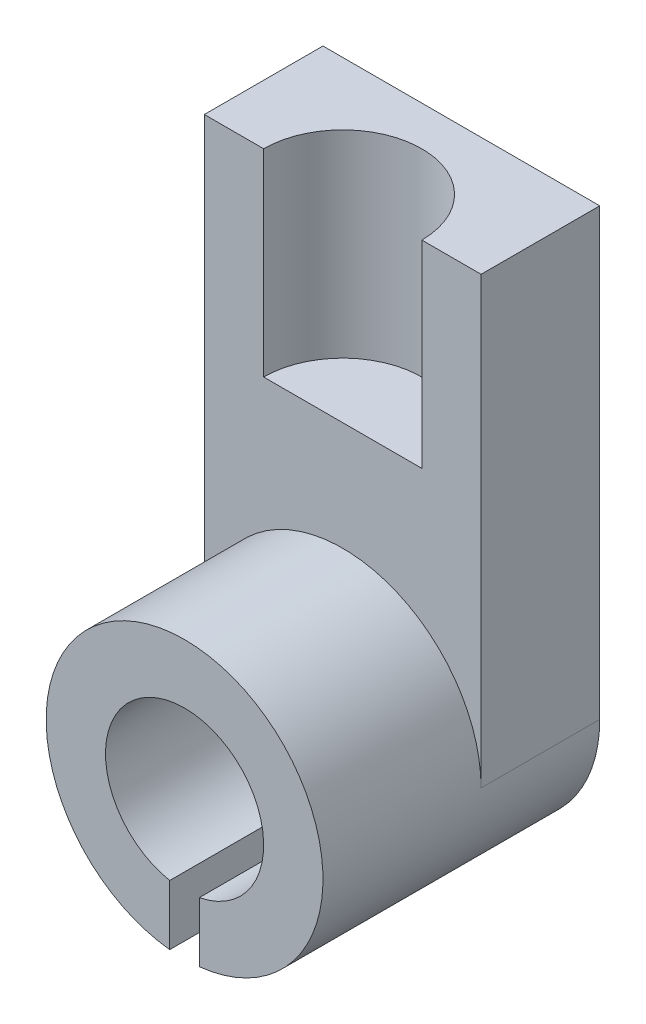
ISO-10303-21;
HEADER;
FILE_DESCRIPTION(('STEP AP214'),'2;1');
FILE_NAME('part.step','',(''),(''),'','','');
FILE_SCHEMA(('AUTOMOTIVE_DESIGN { 1 0 10303 214 1 1 1 1 }'));
ENDSEC;
DATA;
#1=APPLICATION_CONTEXT('core data for automotive mechanical design processes');
#2=APPLICATION_PROTOCOL_DEFINITION('international standard','automotive_design',2000,#1);
#3=PRODUCT_CONTEXT('',#1,'mechanical');
#4=PRODUCT('Part','Part','',(#3));
#5=PRODUCT_RELATED_PRODUCT_CATEGORY('part','',(#4));
#6=PRODUCT_DEFINITION_FORMATION('','',#4);
#7=PRODUCT_DEFINITION_CONTEXT('part definition',#1,'design');
#8=PRODUCT_DEFINITION('design','',#6,#7);
#9=PRODUCT_DEFINITION_SHAPE('','',#8);
#10=(LENGTH_UNIT() NAMED_UNIT(*) SI_UNIT(.MILLI.,.METRE.));
#11=(NAMED_UNIT(*) PLANE_ANGLE_UNIT() SI_UNIT($,.RADIAN.));
#12=(NAMED_UNIT(*) SI_UNIT($,.STERADIAN.) SOLID_ANGLE_UNIT());
#13=UNCERTAINTY_MEASURE_WITH_UNIT(LENGTH_MEASURE(1.E-05),#10,'distance_accuracy_value','');
#14=(GEOMETRIC_REPRESENTATION_CONTEXT(3) GLOBAL_UNCERTAINTY_ASSIGNED_CONTEXT((#13)) GLOBAL_UNIT_ASSIGNED_CONTEXT((#10,
#11,#12)) REPRESENTATION_CONTEXT('',''));
#15=CARTESIAN_POINT('',(0.,0.,0.));
#16=DIRECTION('',(0.,0.,1.));
#17=DIRECTION('',(1.,0.,0.));
#18=AXIS2_PLACEMENT_3D('',#15,#16,#17);
#19=CARTESIAN_POINT('',(0.,0.,56.));
#20=DIRECTION('',(0.,0.,-1.));
#21=DIRECTION('',(-1.,0.,0.));
#22=AXIS2_PLACEMENT_3D('',#19,#20,#21);
#23=CYLINDRICAL_SURFACE('',#22,16.);
#24=CARTESIAN_POINT('',(0.,0.,0.));
#25=DIRECTION('',(0.,0.,-1.));
#26=DIRECTION('',(1.,0.,0.));
#27=AXIS2_PLACEMENT_3D('',#24,#25,#26);
#28=CIRCLE('',#27,16.);
#29=CARTESIAN_POINT('',(-3.,-15.7162336455017,0.));
#30=VERTEX_POINT('',#29);
#31=CARTESIAN_POINT('',(3.,-15.7162336455017,0.));
#32=VERTEX_POINT('',#31);
#33=EDGE_CURVE('E151',#30,#32,#28,.T.);
#34=ORIENTED_EDGE('',*,*,#33,.T.);
#35=DIRECTION('',(0.,0.,-1.));
#36=VECTOR('',#35,1.);
#37=CARTESIAN_POINT('',(3.,-15.7162336455017,56.));
#38=LINE('',#37,#36);
#39=CARTESIAN_POINT('',(3.,-15.7162336455017,56.));
#40=VERTEX_POINT('',#39);
#41=EDGE_CURVE('E11',#40,#32,#38,.T.);
#42=ORIENTED_EDGE('',*,*,#41,.F.);
#43=CARTESIAN_POINT('',(0.,0.,56.));
#44=DIRECTION('',(0.,0.,-1.));
#45=DIRECTION('',(1.,0.,0.));
#46=AXIS2_PLACEMENT_3D('',#43,#44,#45);
#47=CIRCLE('',#46,16.);
#48=CARTESIAN_POINT('',(-3.,-15.7162336455017,56.));
#49=VERTEX_POINT('',#48);
#50=EDGE_CURVE('E155',#49,#40,#47,.T.);
#51=ORIENTED_EDGE('',*,*,#50,.F.);
#52=DIRECTION('',(0.,0.,-1.));
#53=VECTOR('',#52,1.);
#54=CARTESIAN_POINT('',(-3.,-15.7162336455017,56.));
#55=LINE('',#54,#53);
#56=EDGE_CURVE('E165',#49,#30,#55,.T.);
#57=ORIENTED_EDGE('',*,*,#56,.T.);
#58=EDGE_LOOP('',(#34,#42,#51,#57));
#59=FACE_BOUND('',#58,.T.);
#60=ADVANCED_FACE('F33',(#59),#23,.F.);
#61=CARTESIAN_POINT('',(3.,-15.7162336455017,56.));
#62=DIRECTION('',(1.,0.,0.));
#63=DIRECTION('',(0.,1.,0.));
#64=AXIS2_PLACEMENT_3D('',#61,#62,#63);
#65=PLANE('',#64);
#66=DIRECTION('',(0.,-1.,0.));
#67=VECTOR('',#66,1.);
#68=CARTESIAN_POINT('',(3.,-15.7162336455017,0.));
#69=LINE('',#68,#67);
#70=CARTESIAN_POINT('',(2.99999999999998,-27.8388218141501,0.));
#71=VERTEX_POINT('',#70);
#72=EDGE_CURVE('E168',#32,#71,#69,.T.);
#73=ORIENTED_EDGE('',*,*,#72,.T.);
#74=DIRECTION('',(0.,0.,-1.));
#75=VECTOR('',#74,1.);
#76=CARTESIAN_POINT('',(2.99999999999998,-27.8388218141501,56.));
#77=LINE('',#76,#75);
#78=CARTESIAN_POINT('',(2.99999999999998,-27.8388218141501,56.));
#79=VERTEX_POINT('',#78);
#80=EDGE_CURVE('E40',#79,#71,#77,.T.);
#81=ORIENTED_EDGE('',*,*,#80,.F.);
#82=DIRECTION('',(0.,-1.,0.));
#83=VECTOR('',#82,1.);
#84=CARTESIAN_POINT('',(3.,-15.7162336455017,56.));
#85=LINE('',#84,#83);
#86=EDGE_CURVE('E158',#40,#79,#85,.T.);
#87=ORIENTED_EDGE('',*,*,#86,.F.);
#88=ORIENTED_EDGE('',*,*,#41,.T.);
#89=EDGE_LOOP('',(#73,#81,#87,#88));
#90=FACE_BOUND('',#89,.T.);
#91=ADVANCED_FACE('F211',(#90),#65,.F.);
#92=CARTESIAN_POINT('',(0.,0.,56.));
#93=DIRECTION('',(0.,0.,-1.));
#94=DIRECTION('',(-1.,0.,0.));
#95=AXIS2_PLACEMENT_3D('',#92,#93,#94);
#96=CYLINDRICAL_SURFACE('',#95,28.);
#97=CARTESIAN_POINT('',(0.,0.,24.));
#98=DIRECTION('',(0.,0.,1.));
#99=DIRECTION('',(1.,0.,0.));
#100=AXIS2_PLACEMENT_3D('',#97,#98,#99);
#101=CIRCLE('',#100,28.);
#102=CARTESIAN_POINT('',(-28.,0.,24.));
#103=VERTEX_POINT('',#102);
#104=CARTESIAN_POINT('',(28.,0.,24.));
#105=VERTEX_POINT('',#104);
#106=EDGE_CURVE('E55',#103,#105,#101,.F.);
#107=ORIENTED_EDGE('',*,*,#106,.F.);
#108=DIRECTION('',(0.,0.,-1.));
#109=VECTOR('',#108,1.);
#110=CARTESIAN_POINT('',(-28.,0.,56.));
#111=LINE('',#110,#109);
#112=CARTESIAN_POINT('',(-28.,0.,0.));
#113=VERTEX_POINT('',#112);
#114=EDGE_CURVE('E152',#113,#103,#111,.F.);
#115=ORIENTED_EDGE('',*,*,#114,.F.);
#116=CARTESIAN_POINT('',(0.,0.,0.));
#117=DIRECTION('',(0.,0.,1.));
#118=DIRECTION('',(1.,0.,0.));
#119=AXIS2_PLACEMENT_3D('',#116,#117,#118);
#120=CIRCLE('',#119,28.);
#121=CARTESIAN_POINT('',(-3.,-27.8388218141501,0.));
#122=VERTEX_POINT('',#121);
#123=EDGE_CURVE('E170',#113,#122,#120,.T.);
#124=ORIENTED_EDGE('',*,*,#123,.T.);
#125=DIRECTION('',(0.,0.,-1.));
#126=VECTOR('',#125,1.);
#127=CARTESIAN_POINT('',(-3.,-27.8388218141501,56.));
#128=LINE('',#127,#126);
#129=CARTESIAN_POINT('',(-3.,-27.8388218141501,56.));
#130=VERTEX_POINT('',#129);
#131=EDGE_CURVE('E176',#130,#122,#128,.T.);
#132=ORIENTED_EDGE('',*,*,#131,.F.);
#133=CARTESIAN_POINT('',(0.,0.,56.));
#134=DIRECTION('',(0.,0.,1.));
#135=DIRECTION('',(1.,0.,0.));
#136=AXIS2_PLACEMENT_3D('',#133,#134,#135);
#137=CIRCLE('',#136,28.);
#138=EDGE_CURVE('E161',#79,#130,#137,.T.);
#139=ORIENTED_EDGE('',*,*,#138,.F.);
#140=ORIENTED_EDGE('',*,*,#80,.T.);
#141=CARTESIAN_POINT('',(28.,0.,0.));
#142=VERTEX_POINT('',#141);
#143=EDGE_CURVE('E171',#71,#142,#120,.T.);
#144=ORIENTED_EDGE('',*,*,#143,.T.);
#145=DIRECTION('',(0.,0.,-1.));
#146=VECTOR('',#145,1.);
#147=CARTESIAN_POINT('',(28.,0.,56.));
#148=LINE('',#147,#146);
#149=EDGE_CURVE('E149',#142,#105,#148,.F.);
#150=ORIENTED_EDGE('',*,*,#149,.T.);
#151=EDGE_LOOP('',(#107,#115,#124,#132,#139,#140,#144,#150));
#152=FACE_BOUND('',#151,.T.);
#153=ADVANCED_FACE('F182',(#152),#96,.T.);
#154=CARTESIAN_POINT('',(-3.,-27.8388218141501,56.));
#155=DIRECTION('',(-1.,0.,0.));
#156=DIRECTION('',(0.,0.,1.));
#157=AXIS2_PLACEMENT_3D('',#154,#155,#156);
#158=PLANE('',#157);
#159=DIRECTION('',(0.,1.,0.));
#160=VECTOR('',#159,1.);
#161=CARTESIAN_POINT('',(-3.,-27.8388218141501,0.));
#162=LINE('',#161,#160);
#163=EDGE_CURVE('E159',#122,#30,#162,.T.);
#164=ORIENTED_EDGE('',*,*,#163,.T.);
#165=ORIENTED_EDGE('',*,*,#56,.F.);
#166=DIRECTION('',(0.,1.,0.));
#167=VECTOR('',#166,1.);
#168=CARTESIAN_POINT('',(-3.,-27.8388218141501,56.));
#169=LINE('',#168,#167);
#170=EDGE_CURVE('E163',#130,#49,#169,.T.);
#171=ORIENTED_EDGE('',*,*,#170,.F.);
#172=ORIENTED_EDGE('',*,*,#131,.T.);
#173=EDGE_LOOP('',(#164,#165,#171,#172));
#174=FACE_BOUND('',#173,.T.);
#175=ADVANCED_FACE('F204',(#174),#158,.F.);
#176=CARTESIAN_POINT('',(0.,0.,56.));
#177=DIRECTION('',(0.,0.,1.));
#178=DIRECTION('',(1.,0.,0.));
#179=AXIS2_PLACEMENT_3D('',#176,#177,#178);
#180=PLANE('',#179);
#181=ORIENTED_EDGE('',*,*,#50,.T.);
#182=ORIENTED_EDGE('',*,*,#86,.T.);
#183=ORIENTED_EDGE('',*,*,#138,.T.);
#184=ORIENTED_EDGE('',*,*,#170,.T.);
#185=EDGE_LOOP('',(#181,#182,#183,#184));
#186=FACE_BOUND('',#185,.T.);
#187=ADVANCED_FACE('F210',(#186),#180,.T.);
#188=CARTESIAN_POINT('',(0.,0.,0.));
#189=DIRECTION('',(0.,0.,1.));
#190=DIRECTION('',(1.,0.,0.));
#191=AXIS2_PLACEMENT_3D('',#188,#189,#190);
#192=PLANE('',#191);
#193=ORIENTED_EDGE('',*,*,#33,.F.);
#194=ORIENTED_EDGE('',*,*,#163,.F.);
#195=ORIENTED_EDGE('',*,*,#123,.F.);
#196=DIRECTION('',(0.,1.,0.));
#197=VECTOR('',#196,1.);
#198=CARTESIAN_POINT('',(-28.,-27.8408218141501,0.));
#199=LINE('',#198,#197);
#200=CARTESIAN_POINT('',(-28.,90.,0.));
#201=VERTEX_POINT('',#200);
#202=EDGE_CURVE('E139',#113,#201,#199,.T.);
#203=ORIENTED_EDGE('',*,*,#202,.T.);
#204=DIRECTION('',(-1.,0.,0.));
#205=VECTOR('',#204,1.);
#206=CARTESIAN_POINT('',(-28.,90.,0.));
#207=LINE('',#206,#205);
#208=CARTESIAN_POINT('',(28.,90.,0.));
#209=VERTEX_POINT('',#208);
#210=EDGE_CURVE('E136',#209,#201,#207,.T.);
#211=ORIENTED_EDGE('',*,*,#210,.F.);
#212=DIRECTION('',(0.,1.,0.));
#213=VECTOR('',#212,1.);
#214=CARTESIAN_POINT('',(28.,-27.8408218141501,0.));
#215=LINE('',#214,#213);
#216=EDGE_CURVE('E146',#142,#209,#215,.T.);
#217=ORIENTED_EDGE('',*,*,#216,.F.);
#218=ORIENTED_EDGE('',*,*,#143,.F.);
#219=ORIENTED_EDGE('',*,*,#72,.F.);
#220=EDGE_LOOP('',(#193,#194,#195,#203,#211,#217,#218,#219));
#221=FACE_BOUND('',#220,.T.);
#222=ADVANCED_FACE('F189',(#221),#192,.F.);
#223=CARTESIAN_POINT('',(-28.,-27.8408218141501,24.));
#224=DIRECTION('',(0.,0.,1.));
#225=DIRECTION('',(1.,0.,0.));
#226=AXIS2_PLACEMENT_3D('',#223,#224,#225);
#227=PLANE('',#226);
#228=DIRECTION('',(0.,1.,0.));
#229=VECTOR('',#228,1.);
#230=CARTESIAN_POINT('',(16.,50.,24.));
#231=LINE('',#230,#229);
#232=CARTESIAN_POINT('',(16.,50.,24.));
#233=VERTEX_POINT('',#232);
#234=CARTESIAN_POINT('',(16.,90.,24.));
#235=VERTEX_POINT('',#234);
#236=EDGE_CURVE('E47',#233,#235,#231,.T.);
#237=ORIENTED_EDGE('',*,*,#236,.F.);
#238=DIRECTION('',(1.,0.,0.));
#239=VECTOR('',#238,1.);
#240=CARTESIAN_POINT('',(0.,50.,24.));
#241=LINE('',#240,#239);
#242=CARTESIAN_POINT('',(-16.,50.,24.));
#243=VERTEX_POINT('',#242);
#244=EDGE_CURVE('E111',#243,#233,#241,.T.);
#245=ORIENTED_EDGE('',*,*,#244,.F.);
#246=DIRECTION('',(0.,1.,0.));
#247=VECTOR('',#246,1.);
#248=CARTESIAN_POINT('',(-16.,50.,24.));
#249=LINE('',#248,#247);
#250=CARTESIAN_POINT('',(-16.,90.,24.));
#251=VERTEX_POINT('',#250);
#252=EDGE_CURVE('E119',#243,#251,#249,.T.);
#253=ORIENTED_EDGE('',*,*,#252,.T.);
#254=DIRECTION('',(1.,0.,0.));
#255=VECTOR('',#254,1.);
#256=CARTESIAN_POINT('',(-28.,90.,24.));
#257=LINE('',#256,#255);
#258=CARTESIAN_POINT('',(-28.,90.,24.));
#259=VERTEX_POINT('',#258);
#260=EDGE_CURVE('E130',#259,#251,#257,.T.);
#261=ORIENTED_EDGE('',*,*,#260,.F.);
#262=DIRECTION('',(0.,1.,0.));
#263=VECTOR('',#262,1.);
#264=CARTESIAN_POINT('',(-28.,-27.8408218141501,24.));
#265=LINE('',#264,#263);
#266=EDGE_CURVE('E142',#103,#259,#265,.T.);
#267=ORIENTED_EDGE('',*,*,#266,.F.);
#268=ORIENTED_EDGE('',*,*,#106,.T.);
#269=DIRECTION('',(0.,1.,0.));
#270=VECTOR('',#269,1.);
#271=CARTESIAN_POINT('',(28.,-27.8408218141501,24.));
#272=LINE('',#271,#270);
#273=CARTESIAN_POINT('',(28.,90.,24.));
#274=VERTEX_POINT('',#273);
#275=EDGE_CURVE('E144',#105,#274,#272,.T.);
#276=ORIENTED_EDGE('',*,*,#275,.T.);
#277=EDGE_CURVE('E124',#235,#274,#257,.T.);
#278=ORIENTED_EDGE('',*,*,#277,.F.);
#279=EDGE_LOOP('',(#237,#245,#253,#261,#267,#268,#276,#278));
#280=FACE_BOUND('',#279,.T.);
#281=ADVANCED_FACE('F122',(#280),#227,.T.);
#282=CARTESIAN_POINT('',(0.,90.,0.));
#283=DIRECTION('',(0.,1.,0.));
#284=DIRECTION('',(0.,0.,1.));
#285=AXIS2_PLACEMENT_3D('',#282,#283,#284);
#286=PLANE('',#285);
#287=CARTESIAN_POINT('',(0.,90.,24.));
#288=DIRECTION('',(0.,1.,0.));
#289=DIRECTION('',(0.,0.,1.));
#290=AXIS2_PLACEMENT_3D('',#287,#288,#289);
#291=CIRCLE('',#290,16.);
#292=EDGE_CURVE('E116',#235,#251,#291,.T.);
#293=ORIENTED_EDGE('',*,*,#292,.F.);
#294=ORIENTED_EDGE('',*,*,#277,.T.);
#295=DIRECTION('',(0.,0.,-1.));
#296=VECTOR('',#295,1.);
#297=CARTESIAN_POINT('',(28.,90.,0.));
#298=LINE('',#297,#296);
#299=EDGE_CURVE('E133',#274,#209,#298,.T.);
#300=ORIENTED_EDGE('',*,*,#299,.T.);
#301=ORIENTED_EDGE('',*,*,#210,.T.);
#302=DIRECTION('',(0.,0.,1.));
#303=VECTOR('',#302,1.);
#304=CARTESIAN_POINT('',(-28.,90.,0.));
#305=LINE('',#304,#303);
#306=EDGE_CURVE('E126',#201,#259,#305,.T.);
#307=ORIENTED_EDGE('',*,*,#306,.T.);
#308=ORIENTED_EDGE('',*,*,#260,.T.);
#309=EDGE_LOOP('',(#293,#294,#300,#301,#307,#308));
#310=FACE_BOUND('',#309,.T.);
#311=ADVANCED_FACE('F227',(#310),#286,.T.);
#312=CARTESIAN_POINT('',(-28.,-27.8408218141501,0.));
#313=DIRECTION('',(-1.,0.,0.));
#314=DIRECTION('',(0.,0.,1.));
#315=AXIS2_PLACEMENT_3D('',#312,#313,#314);
#316=PLANE('',#315);
#317=ORIENTED_EDGE('',*,*,#202,.F.);
#318=ORIENTED_EDGE('',*,*,#114,.T.);
#319=ORIENTED_EDGE('',*,*,#266,.T.);
#320=ORIENTED_EDGE('',*,*,#306,.F.);
#321=EDGE_LOOP('',(#317,#318,#319,#320));
#322=FACE_BOUND('',#321,.T.);
#323=ADVANCED_FACE('F200',(#322),#316,.T.);
#324=CARTESIAN_POINT('',(28.,-27.8408218141501,0.));
#325=DIRECTION('',(1.,0.,0.));
#326=DIRECTION('',(0.,0.,-1.));
#327=AXIS2_PLACEMENT_3D('',#324,#325,#326);
#328=PLANE('',#327);
#329=ORIENTED_EDGE('',*,*,#149,.F.);
#330=ORIENTED_EDGE('',*,*,#216,.T.);
#331=ORIENTED_EDGE('',*,*,#299,.F.);
#332=ORIENTED_EDGE('',*,*,#275,.F.);
#333=EDGE_LOOP('',(#329,#330,#331,#332));
#334=FACE_BOUND('',#333,.T.);
#335=ADVANCED_FACE('F193',(#334),#328,.T.);
#336=CARTESIAN_POINT('',(0.,50.,24.));
#337=DIRECTION('',(0.,1.,0.));
#338=DIRECTION('',(0.,0.,1.));
#339=AXIS2_PLACEMENT_3D('',#336,#337,#338);
#340=CYLINDRICAL_SURFACE('',#339,16.);
#341=ORIENTED_EDGE('',*,*,#292,.T.);
#342=ORIENTED_EDGE('',*,*,#252,.F.);
#343=CARTESIAN_POINT('',(0.,50.,24.));
#344=DIRECTION('',(0.,1.,0.));
#345=DIRECTION('',(0.,0.,1.));
#346=AXIS2_PLACEMENT_3D('',#343,#344,#345);
#347=CIRCLE('',#346,16.);
#348=EDGE_CURVE('E113',#233,#243,#347,.T.);
#349=ORIENTED_EDGE('',*,*,#348,.F.);
#350=ORIENTED_EDGE('',*,*,#236,.T.);
#351=EDGE_LOOP('',(#341,#342,#349,#350));
#352=FACE_BOUND('',#351,.T.);
#353=ADVANCED_FACE('F118',(#352),#340,.F.);
#354=CARTESIAN_POINT('',(0.,50.,0.));
#355=DIRECTION('',(0.,1.,0.));
#356=DIRECTION('',(0.,0.,1.));
#357=AXIS2_PLACEMENT_3D('',#354,#355,#356);
#358=PLANE('',#357);
#359=ORIENTED_EDGE('',*,*,#244,.T.);
#360=ORIENTED_EDGE('',*,*,#348,.T.);
#361=EDGE_LOOP('',(#359,#360));
#362=FACE_BOUND('',#361,.T.);
#363=ADVANCED_FACE('F112',(#362),#358,.T.);
#364=CLOSED_SHELL('',(#60,#91,#153,#175,#187,#222,#281,#311,#323,#335,#353,#363));
#365=MANIFOLD_SOLID_BREP('B2',#364);
#366=ADVANCED_BREP_SHAPE_REPRESENTATION('',(#18,#365),#14);
#367=SHAPE_DEFINITION_REPRESENTATION(#9,#366);
ENDSEC;
END-ISO-10303-21;
